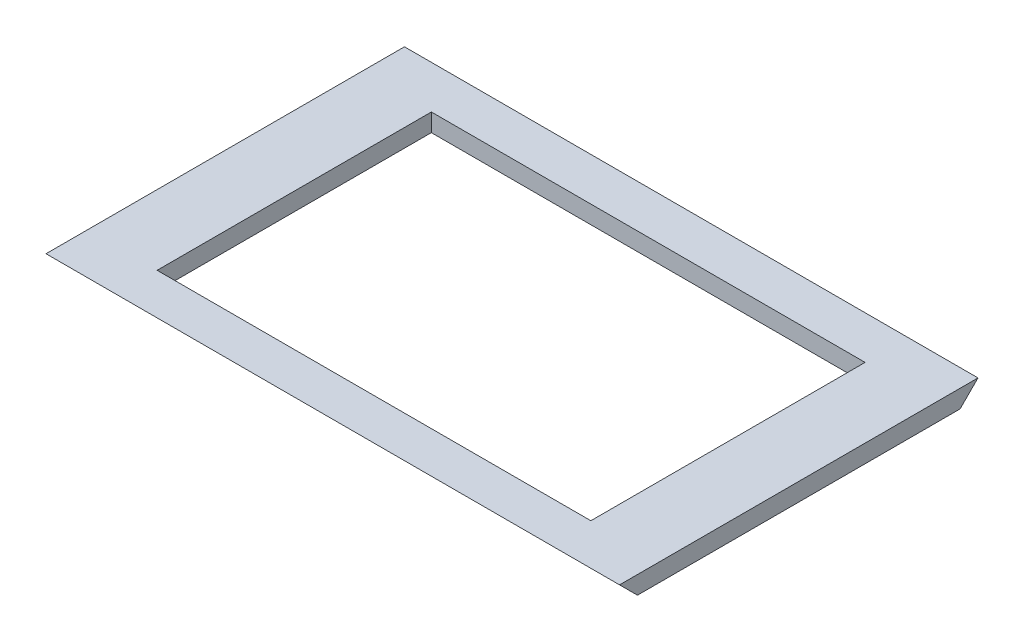
ISO-10303-21;
HEADER;
FILE_DESCRIPTION(('STEP AP214'),'2;1');
FILE_NAME('part.step','',(''),(''),'','','');
FILE_SCHEMA(('AUTOMOTIVE_DESIGN { 1 0 10303 214 1 1 1 1 }'));
ENDSEC;
DATA;
#1=APPLICATION_CONTEXT('core data for automotive mechanical design processes');
#2=APPLICATION_PROTOCOL_DEFINITION('international standard','automotive_design',2000,#1);
#3=PRODUCT_CONTEXT('',#1,'mechanical');
#4=PRODUCT('Part','Part','',(#3));
#5=PRODUCT_RELATED_PRODUCT_CATEGORY('part','',(#4));
#6=PRODUCT_DEFINITION_FORMATION('','',#4);
#7=PRODUCT_DEFINITION_CONTEXT('part definition',#1,'design');
#8=PRODUCT_DEFINITION('design','',#6,#7);
#9=PRODUCT_DEFINITION_SHAPE('','',#8);
#10=(LENGTH_UNIT() NAMED_UNIT(*) SI_UNIT(.MILLI.,.METRE.));
#11=(NAMED_UNIT(*) PLANE_ANGLE_UNIT() SI_UNIT($,.RADIAN.));
#12=(NAMED_UNIT(*) SI_UNIT($,.STERADIAN.) SOLID_ANGLE_UNIT());
#13=UNCERTAINTY_MEASURE_WITH_UNIT(LENGTH_MEASURE(1.E-05),#10,'distance_accuracy_value','');
#14=(GEOMETRIC_REPRESENTATION_CONTEXT(3) GLOBAL_UNCERTAINTY_ASSIGNED_CONTEXT((#13)) GLOBAL_UNIT_ASSIGNED_CONTEXT((#10,
#11,#12)) REPRESENTATION_CONTEXT('',''));
#15=CARTESIAN_POINT('',(0.,0.,0.));
#16=DIRECTION('',(0.,0.,1.));
#17=DIRECTION('',(1.,0.,0.));
#18=AXIS2_PLACEMENT_3D('',#15,#16,#17);
#19=CARTESIAN_POINT('',(300.,-2.5,50.));
#20=DIRECTION('',(0.,1.,0.));
#21=DIRECTION('',(0.,0.,1.));
#22=AXIS2_PLACEMENT_3D('',#19,#20,#21);
#23=PLANE('',#22);
#24=DIRECTION('',(-1.,0.,0.));
#25=VECTOR('',#24,1.);
#26=CARTESIAN_POINT('',(89.5,-2.5,-38.));
#27=LINE('',#26,#25);
#28=CARTESIAN_POINT('',(210.5,-2.5,-38.));
#29=VERTEX_POINT('',#28);
#30=CARTESIAN_POINT('',(89.5,-2.5,-38.));
#31=VERTEX_POINT('',#30);
#32=EDGE_CURVE('E127',#29,#31,#27,.T.);
#33=ORIENTED_EDGE('',*,*,#32,.T.);
#34=DIRECTION('',(0.,0.,1.));
#35=VECTOR('',#34,1.);
#36=CARTESIAN_POINT('',(89.5,-2.5,-38.));
#37=LINE('',#36,#35);
#38=CARTESIAN_POINT('',(89.5,-2.5,38.5));
#39=VERTEX_POINT('',#38);
#40=EDGE_CURVE('E135',#31,#39,#37,.T.);
#41=ORIENTED_EDGE('',*,*,#40,.T.);
#42=DIRECTION('',(1.,0.,0.));
#43=VECTOR('',#42,1.);
#44=CARTESIAN_POINT('',(89.5,-2.5,38.5));
#45=LINE('',#44,#43);
#46=CARTESIAN_POINT('',(210.5,-2.5,38.5));
#47=VERTEX_POINT('',#46);
#48=EDGE_CURVE('E150',#39,#47,#45,.T.);
#49=ORIENTED_EDGE('',*,*,#48,.T.);
#50=DIRECTION('',(0.,0.,-1.));
#51=VECTOR('',#50,1.);
#52=CARTESIAN_POINT('',(210.5,-2.5,-38.));
#53=LINE('',#52,#51);
#54=EDGE_CURVE('E147',#47,#29,#53,.T.);
#55=ORIENTED_EDGE('',*,*,#54,.T.);
#56=EDGE_LOOP('',(#33,#41,#49,#55));
#57=FACE_BOUND('',#56,.T.);
#58=DIRECTION('',(1.,0.,0.));
#59=VECTOR('',#58,1.);
#60=CARTESIAN_POINT('',(0.,-2.5,-45.0000000000001));
#61=LINE('',#60,#59);
#62=CARTESIAN_POINT('',(70.,-2.5,-45.0000000000001));
#63=VERTEX_POINT('',#62);
#64=CARTESIAN_POINT('',(230.,-2.5,-45.0000000000001));
#65=VERTEX_POINT('',#64);
#66=EDGE_CURVE('E144',#63,#65,#61,.T.);
#67=ORIENTED_EDGE('',*,*,#66,.T.);
#68=DIRECTION('',(0.,0.,1.));
#69=VECTOR('',#68,1.);
#70=CARTESIAN_POINT('',(230.,-2.5,-50.));
#71=LINE('',#70,#69);
#72=CARTESIAN_POINT('',(230.,-2.5,45.));
#73=VERTEX_POINT('',#72);
#74=EDGE_CURVE('E60',#65,#73,#71,.T.);
#75=ORIENTED_EDGE('',*,*,#74,.T.);
#76=DIRECTION('',(1.,0.,0.));
#77=VECTOR('',#76,1.);
#78=CARTESIAN_POINT('',(0.,-2.5,45.));
#79=LINE('',#78,#77);
#80=CARTESIAN_POINT('',(70.,-2.5,45.));
#81=VERTEX_POINT('',#80);
#82=EDGE_CURVE('E117',#81,#73,#79,.T.);
#83=ORIENTED_EDGE('',*,*,#82,.F.);
#84=DIRECTION('',(0.,0.,-1.));
#85=VECTOR('',#84,1.);
#86=CARTESIAN_POINT('',(70.,-2.5,-50.));
#87=LINE('',#86,#85);
#88=EDGE_CURVE('E113',#81,#63,#87,.T.);
#89=ORIENTED_EDGE('',*,*,#88,.T.);
#90=EDGE_LOOP('',(#67,#75,#83,#89));
#91=FACE_BOUND('',#90,.T.);
#92=ADVANCED_FACE('F38',(#57,#91),#23,.F.);
#93=CARTESIAN_POINT('',(300.,2.5,50.));
#94=DIRECTION('',(0.,-1.,0.));
#95=DIRECTION('',(0.,0.,-1.));
#96=AXIS2_PLACEMENT_3D('',#93,#94,#95);
#97=PLANE('',#96);
#98=DIRECTION('',(1.,0.,0.));
#99=VECTOR('',#98,1.);
#100=CARTESIAN_POINT('',(89.5,2.5,38.5));
#101=LINE('',#100,#99);
#102=CARTESIAN_POINT('',(89.5,2.5,38.5));
#103=VERTEX_POINT('',#102);
#104=CARTESIAN_POINT('',(210.5,2.5,38.5));
#105=VERTEX_POINT('',#104);
#106=EDGE_CURVE('E139',#103,#105,#101,.T.);
#107=ORIENTED_EDGE('',*,*,#106,.F.);
#108=DIRECTION('',(0.,0.,1.));
#109=VECTOR('',#108,1.);
#110=CARTESIAN_POINT('',(89.5,2.5,-38.));
#111=LINE('',#110,#109);
#112=CARTESIAN_POINT('',(89.5,2.5,-38.));
#113=VERTEX_POINT('',#112);
#114=EDGE_CURVE('E142',#113,#103,#111,.T.);
#115=ORIENTED_EDGE('',*,*,#114,.F.);
#116=DIRECTION('',(-1.,0.,0.));
#117=VECTOR('',#116,1.);
#118=CARTESIAN_POINT('',(89.5,2.5,-38.));
#119=LINE('',#118,#117);
#120=CARTESIAN_POINT('',(210.5,2.5,-38.));
#121=VERTEX_POINT('',#120);
#122=EDGE_CURVE('E132',#121,#113,#119,.T.);
#123=ORIENTED_EDGE('',*,*,#122,.F.);
#124=DIRECTION('',(0.,0.,-1.));
#125=VECTOR('',#124,1.);
#126=CARTESIAN_POINT('',(210.5,2.5,-38.));
#127=LINE('',#126,#125);
#128=EDGE_CURVE('E136',#105,#121,#127,.T.);
#129=ORIENTED_EDGE('',*,*,#128,.F.);
#130=EDGE_LOOP('',(#107,#115,#123,#129));
#131=FACE_BOUND('',#130,.T.);
#132=DIRECTION('',(-1.,0.,0.));
#133=VECTOR('',#132,1.);
#134=CARTESIAN_POINT('',(300.,2.5,50.));
#135=LINE('',#134,#133);
#136=CARTESIAN_POINT('',(230.,2.5,50.));
#137=VERTEX_POINT('',#136);
#138=CARTESIAN_POINT('',(70.,2.5,50.));
#139=VERTEX_POINT('',#138);
#140=EDGE_CURVE('E112',#137,#139,#135,.T.);
#141=ORIENTED_EDGE('',*,*,#140,.F.);
#142=DIRECTION('',(0.,0.,1.));
#143=VECTOR('',#142,1.);
#144=CARTESIAN_POINT('',(230.,2.5,-50.));
#145=LINE('',#144,#143);
#146=CARTESIAN_POINT('',(230.,2.5,-50.));
#147=VERTEX_POINT('',#146);
#148=EDGE_CURVE('E100',#147,#137,#145,.T.);
#149=ORIENTED_EDGE('',*,*,#148,.F.);
#150=DIRECTION('',(-1.,0.,0.));
#151=VECTOR('',#150,1.);
#152=CARTESIAN_POINT('',(300.,2.5,-50.));
#153=LINE('',#152,#151);
#154=CARTESIAN_POINT('',(70.,2.5,-50.));
#155=VERTEX_POINT('',#154);
#156=EDGE_CURVE('E110',#147,#155,#153,.T.);
#157=ORIENTED_EDGE('',*,*,#156,.T.);
#158=DIRECTION('',(0.,0.,-1.));
#159=VECTOR('',#158,1.);
#160=CARTESIAN_POINT('',(70.,2.5,-50.));
#161=LINE('',#160,#159);
#162=EDGE_CURVE('E52',#139,#155,#161,.T.);
#163=ORIENTED_EDGE('',*,*,#162,.F.);
#164=EDGE_LOOP('',(#141,#149,#157,#163));
#165=FACE_BOUND('',#164,.T.);
#166=ADVANCED_FACE('F109',(#131,#165),#97,.F.);
#167=CARTESIAN_POINT('',(0.,2.5,50.));
#168=DIRECTION('',(0.,0.707106781186547,-0.707106781186548));
#169=DIRECTION('',(0.,0.707106781186548,0.707106781186547));
#170=AXIS2_PLACEMENT_3D('',#167,#168,#169);
#171=PLANE('',#170);
#172=ORIENTED_EDGE('',*,*,#82,.T.);
#173=DIRECTION('',(0.,0.707106781186548,0.707106781186547));
#174=VECTOR('',#173,1.);
#175=CARTESIAN_POINT('',(230.,2.5,50.));
#176=LINE('',#175,#174);
#177=EDGE_CURVE('E156',#73,#137,#176,.T.);
#178=ORIENTED_EDGE('',*,*,#177,.T.);
#179=ORIENTED_EDGE('',*,*,#140,.T.);
#180=DIRECTION('',(0.,-0.707106781186548,-0.707106781186547));
#181=VECTOR('',#180,1.);
#182=CARTESIAN_POINT('',(70.,2.5,50.));
#183=LINE('',#182,#181);
#184=EDGE_CURVE('E158',#139,#81,#183,.T.);
#185=ORIENTED_EDGE('',*,*,#184,.T.);
#186=EDGE_LOOP('',(#172,#178,#179,#185));
#187=FACE_BOUND('',#186,.T.);
#188=ADVANCED_FACE('F167',(#187),#171,.F.);
#189=CARTESIAN_POINT('',(89.5,-2.5,-38.));
#190=DIRECTION('',(-1.,0.,0.));
#191=DIRECTION('',(0.,0.,1.));
#192=AXIS2_PLACEMENT_3D('',#189,#190,#191);
#193=PLANE('',#192);
#194=ORIENTED_EDGE('',*,*,#114,.T.);
#195=DIRECTION('',(0.,1.,0.));
#196=VECTOR('',#195,1.);
#197=CARTESIAN_POINT('',(89.5,-2.5,38.5));
#198=LINE('',#197,#196);
#199=EDGE_CURVE('E123',#39,#103,#198,.T.);
#200=ORIENTED_EDGE('',*,*,#199,.F.);
#201=ORIENTED_EDGE('',*,*,#40,.F.);
#202=DIRECTION('',(0.,1.,0.));
#203=VECTOR('',#202,1.);
#204=CARTESIAN_POINT('',(89.5,-2.5,-38.));
#205=LINE('',#204,#203);
#206=EDGE_CURVE('E122',#31,#113,#205,.T.);
#207=ORIENTED_EDGE('',*,*,#206,.T.);
#208=EDGE_LOOP('',(#194,#200,#201,#207));
#209=FACE_BOUND('',#208,.T.);
#210=ADVANCED_FACE('F193',(#209),#193,.F.);
#211=CARTESIAN_POINT('',(89.5,-2.5,-38.));
#212=DIRECTION('',(0.,0.,-1.));
#213=DIRECTION('',(-1.,0.,0.));
#214=AXIS2_PLACEMENT_3D('',#211,#212,#213);
#215=PLANE('',#214);
#216=ORIENTED_EDGE('',*,*,#122,.T.);
#217=ORIENTED_EDGE('',*,*,#206,.F.);
#218=ORIENTED_EDGE('',*,*,#32,.F.);
#219=DIRECTION('',(0.,1.,0.));
#220=VECTOR('',#219,1.);
#221=CARTESIAN_POINT('',(210.5,-2.5,-38.));
#222=LINE('',#221,#220);
#223=EDGE_CURVE('E129',#29,#121,#222,.T.);
#224=ORIENTED_EDGE('',*,*,#223,.T.);
#225=EDGE_LOOP('',(#216,#217,#218,#224));
#226=FACE_BOUND('',#225,.T.);
#227=ADVANCED_FACE('F189',(#226),#215,.F.);
#228=CARTESIAN_POINT('',(210.5,-2.5,-38.));
#229=DIRECTION('',(1.,0.,0.));
#230=DIRECTION('',(0.,0.,-1.));
#231=AXIS2_PLACEMENT_3D('',#228,#229,#230);
#232=PLANE('',#231);
#233=ORIENTED_EDGE('',*,*,#128,.T.);
#234=ORIENTED_EDGE('',*,*,#223,.F.);
#235=ORIENTED_EDGE('',*,*,#54,.F.);
#236=DIRECTION('',(0.,1.,0.));
#237=VECTOR('',#236,1.);
#238=CARTESIAN_POINT('',(210.5,-2.5,38.5));
#239=LINE('',#238,#237);
#240=EDGE_CURVE('E126',#47,#105,#239,.T.);
#241=ORIENTED_EDGE('',*,*,#240,.T.);
#242=EDGE_LOOP('',(#233,#234,#235,#241));
#243=FACE_BOUND('',#242,.T.);
#244=ADVANCED_FACE('F200',(#243),#232,.F.);
#245=CARTESIAN_POINT('',(89.5,-2.5,38.5));
#246=DIRECTION('',(0.,0.,1.));
#247=DIRECTION('',(0.,-1.,0.));
#248=AXIS2_PLACEMENT_3D('',#245,#246,#247);
#249=PLANE('',#248);
#250=ORIENTED_EDGE('',*,*,#106,.T.);
#251=ORIENTED_EDGE('',*,*,#240,.F.);
#252=ORIENTED_EDGE('',*,*,#48,.F.);
#253=ORIENTED_EDGE('',*,*,#199,.T.);
#254=EDGE_LOOP('',(#250,#251,#252,#253));
#255=FACE_BOUND('',#254,.T.);
#256=ADVANCED_FACE('F177',(#255),#249,.F.);
#257=CARTESIAN_POINT('',(0.,2.5,-50.));
#258=DIRECTION('',(0.,0.707106781186541,0.707106781186554));
#259=DIRECTION('',(0.,-0.707106781186554,0.707106781186541));
#260=AXIS2_PLACEMENT_3D('',#257,#258,#259);
#261=PLANE('',#260);
#262=ORIENTED_EDGE('',*,*,#156,.F.);
#263=DIRECTION('',(0.,-0.707106781186554,0.707106781186541));
#264=VECTOR('',#263,1.);
#265=CARTESIAN_POINT('',(230.,2.5,-50.));
#266=LINE('',#265,#264);
#267=EDGE_CURVE('E11',#147,#65,#266,.T.);
#268=ORIENTED_EDGE('',*,*,#267,.T.);
#269=ORIENTED_EDGE('',*,*,#66,.F.);
#270=DIRECTION('',(0.,0.707106781186554,-0.707106781186541));
#271=VECTOR('',#270,1.);
#272=CARTESIAN_POINT('',(70.,2.5,-50.));
#273=LINE('',#272,#271);
#274=EDGE_CURVE('E45',#63,#155,#273,.T.);
#275=ORIENTED_EDGE('',*,*,#274,.T.);
#276=EDGE_LOOP('',(#262,#268,#269,#275));
#277=FACE_BOUND('',#276,.T.);
#278=ADVANCED_FACE('F115',(#277),#261,.F.);
#279=CARTESIAN_POINT('',(70.,-2.5,-50.));
#280=DIRECTION('',(1.,0.,0.));
#281=DIRECTION('',(0.,0.,-1.));
#282=AXIS2_PLACEMENT_3D('',#279,#280,#281);
#283=PLANE('',#282);
#284=ORIENTED_EDGE('',*,*,#162,.T.);
#285=ORIENTED_EDGE('',*,*,#274,.F.);
#286=ORIENTED_EDGE('',*,*,#88,.F.);
#287=ORIENTED_EDGE('',*,*,#184,.F.);
#288=EDGE_LOOP('',(#284,#285,#286,#287));
#289=FACE_BOUND('',#288,.T.);
#290=ADVANCED_FACE('F168',(#289),#283,.F.);
#291=CARTESIAN_POINT('',(230.,-2.5,-50.));
#292=DIRECTION('',(-1.,0.,0.));
#293=DIRECTION('',(0.,0.,1.));
#294=AXIS2_PLACEMENT_3D('',#291,#292,#293);
#295=PLANE('',#294);
#296=ORIENTED_EDGE('',*,*,#74,.F.);
#297=ORIENTED_EDGE('',*,*,#267,.F.);
#298=ORIENTED_EDGE('',*,*,#148,.T.);
#299=ORIENTED_EDGE('',*,*,#177,.F.);
#300=EDGE_LOOP('',(#296,#297,#298,#299));
#301=FACE_BOUND('',#300,.T.);
#302=ADVANCED_FACE('F99',(#301),#295,.F.);
#303=CLOSED_SHELL('',(#92,#166,#188,#210,#227,#244,#256,#278,#290,#302));
#304=MANIFOLD_SOLID_BREP('B2',#303);
#305=ADVANCED_BREP_SHAPE_REPRESENTATION('',(#18,#304),#14);
#306=SHAPE_DEFINITION_REPRESENTATION(#9,#305);
ENDSEC;
END-ISO-10303-21;
